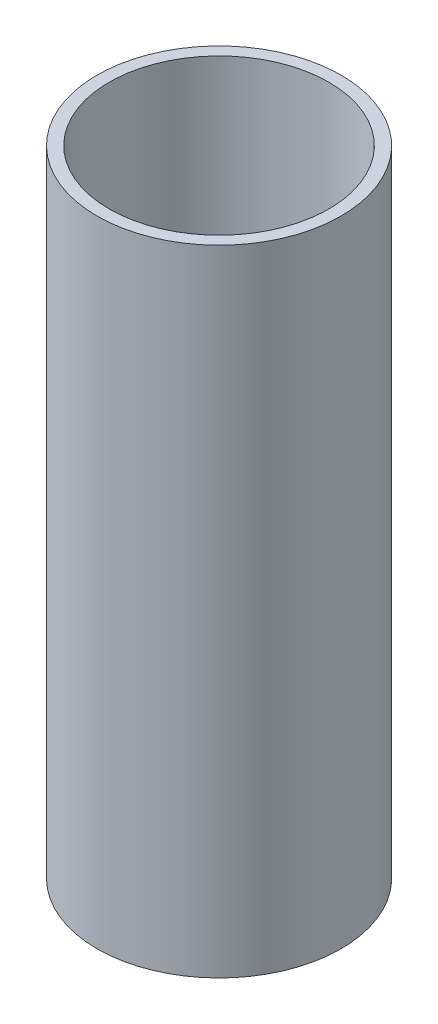
ISO-10303-21;
HEADER;
FILE_DESCRIPTION(('STEP AP214'),'2;1');
FILE_NAME('part.step','',(''),(''),'','','');
FILE_SCHEMA(('AUTOMOTIVE_DESIGN { 1 0 10303 214 1 1 1 1 }'));
ENDSEC;
DATA;
#1=APPLICATION_CONTEXT('core data for automotive mechanical design processes');
#2=APPLICATION_PROTOCOL_DEFINITION('international standard','automotive_design',2000,#1);
#3=PRODUCT_CONTEXT('',#1,'mechanical');
#4=PRODUCT('Part','Part','',(#3));
#5=PRODUCT_RELATED_PRODUCT_CATEGORY('part','',(#4));
#6=PRODUCT_DEFINITION_FORMATION('','',#4);
#7=PRODUCT_DEFINITION_CONTEXT('part definition',#1,'design');
#8=PRODUCT_DEFINITION('design','',#6,#7);
#9=PRODUCT_DEFINITION_SHAPE('','',#8);
#10=(LENGTH_UNIT() NAMED_UNIT(*) SI_UNIT(.MILLI.,.METRE.));
#11=(NAMED_UNIT(*) PLANE_ANGLE_UNIT() SI_UNIT($,.RADIAN.));
#12=(NAMED_UNIT(*) SI_UNIT($,.STERADIAN.) SOLID_ANGLE_UNIT());
#13=UNCERTAINTY_MEASURE_WITH_UNIT(LENGTH_MEASURE(1.E-05),#10,'distance_accuracy_value','');
#14=(GEOMETRIC_REPRESENTATION_CONTEXT(3) GLOBAL_UNCERTAINTY_ASSIGNED_CONTEXT((#13)) GLOBAL_UNIT_ASSIGNED_CONTEXT((#10,
#11,#12)) REPRESENTATION_CONTEXT('',''));
#15=CARTESIAN_POINT('',(0.,0.,0.));
#16=DIRECTION('',(0.,0.,1.));
#17=DIRECTION('',(1.,0.,0.));
#18=AXIS2_PLACEMENT_3D('',#15,#16,#17);
#19=CARTESIAN_POINT('',(0.,130.,0.));
#20=DIRECTION('',(0.,1.,0.));
#21=DIRECTION('',(0.,0.,1.));
#22=AXIS2_PLACEMENT_3D('',#19,#20,#21);
#23=PLANE('',#22);
#24=CARTESIAN_POINT('',(0.,130.,0.));
#25=DIRECTION('',(0.,1.,0.));
#26=DIRECTION('',(0.,0.,1.));
#27=AXIS2_PLACEMENT_3D('',#24,#25,#26);
#28=CIRCLE('',#27,25.);
#29=CARTESIAN_POINT('',(0.,130.,25.));
#30=VERTEX_POINT('',#29);
#31=EDGE_CURVE('E10',#30,#30,#28,.T.);
#32=ORIENTED_EDGE('',*,*,#31,.T.);
#33=EDGE_LOOP('',(#32));
#34=FACE_BOUND('',#33,.T.);
#35=CARTESIAN_POINT('',(0.,130.,0.));
#36=DIRECTION('',(0.,1.,0.));
#37=DIRECTION('',(0.,0.,1.));
#38=AXIS2_PLACEMENT_3D('',#35,#36,#37);
#39=CIRCLE('',#38,22.5);
#40=CARTESIAN_POINT('',(0.,130.,22.5));
#41=VERTEX_POINT('',#40);
#42=EDGE_CURVE('E54',#41,#41,#39,.T.);
#43=ORIENTED_EDGE('',*,*,#42,.F.);
#44=EDGE_LOOP('',(#43));
#45=FACE_BOUND('',#44,.T.);
#46=ADVANCED_FACE('F41',(#34,#45),#23,.T.);
#47=CARTESIAN_POINT('',(0.,0.,0.));
#48=DIRECTION('',(0.,1.,0.));
#49=DIRECTION('',(0.,0.,1.));
#50=AXIS2_PLACEMENT_3D('',#47,#48,#49);
#51=PLANE('',#50);
#52=CARTESIAN_POINT('',(0.,0.,0.));
#53=DIRECTION('',(0.,1.,0.));
#54=DIRECTION('',(0.,0.,1.));
#55=AXIS2_PLACEMENT_3D('',#52,#53,#54);
#56=CIRCLE('',#55,25.);
#57=CARTESIAN_POINT('',(0.,0.,25.));
#58=VERTEX_POINT('',#57);
#59=EDGE_CURVE('E45',#58,#58,#56,.T.);
#60=ORIENTED_EDGE('',*,*,#59,.F.);
#61=EDGE_LOOP('',(#60));
#62=FACE_BOUND('',#61,.T.);
#63=CARTESIAN_POINT('',(0.,0.,0.));
#64=DIRECTION('',(0.,1.,0.));
#65=DIRECTION('',(0.,0.,1.));
#66=AXIS2_PLACEMENT_3D('',#63,#64,#65);
#67=CIRCLE('',#66,22.5);
#68=CARTESIAN_POINT('',(0.,0.,22.5));
#69=VERTEX_POINT('',#68);
#70=EDGE_CURVE('E56',#69,#69,#67,.T.);
#71=ORIENTED_EDGE('',*,*,#70,.T.);
#72=EDGE_LOOP('',(#71));
#73=FACE_BOUND('',#72,.T.);
#74=ADVANCED_FACE('F68',(#62,#73),#51,.F.);
#75=CARTESIAN_POINT('',(0.,130.,0.));
#76=DIRECTION('',(0.,-1.,0.));
#77=DIRECTION('',(0.,0.,-1.));
#78=AXIS2_PLACEMENT_3D('',#75,#76,#77);
#79=CYLINDRICAL_SURFACE('',#78,25.);
#80=ORIENTED_EDGE('',*,*,#31,.F.);
#81=EDGE_LOOP('',(#80));
#82=FACE_BOUND('',#81,.T.);
#83=ORIENTED_EDGE('',*,*,#59,.T.);
#84=EDGE_LOOP('',(#83));
#85=FACE_BOUND('',#84,.T.);
#86=ADVANCED_FACE('F43',(#82,#85),#79,.T.);
#87=CARTESIAN_POINT('',(0.,130.,0.));
#88=DIRECTION('',(0.,-1.,0.));
#89=DIRECTION('',(0.,0.,-1.));
#90=AXIS2_PLACEMENT_3D('',#87,#88,#89);
#91=CYLINDRICAL_SURFACE('',#90,22.5);
#92=ORIENTED_EDGE('',*,*,#42,.T.);
#93=EDGE_LOOP('',(#92));
#94=FACE_BOUND('',#93,.T.);
#95=ORIENTED_EDGE('',*,*,#70,.F.);
#96=EDGE_LOOP('',(#95));
#97=FACE_BOUND('',#96,.T.);
#98=ADVANCED_FACE('F64',(#94,#97),#91,.F.);
#99=CLOSED_SHELL('',(#46,#74,#86,#98));
#100=MANIFOLD_SOLID_BREP('B2',#99);
#101=ADVANCED_BREP_SHAPE_REPRESENTATION('',(#18,#100),#14);
#102=SHAPE_DEFINITION_REPRESENTATION(#9,#101);
ENDSEC;
END-ISO-10303-21;
